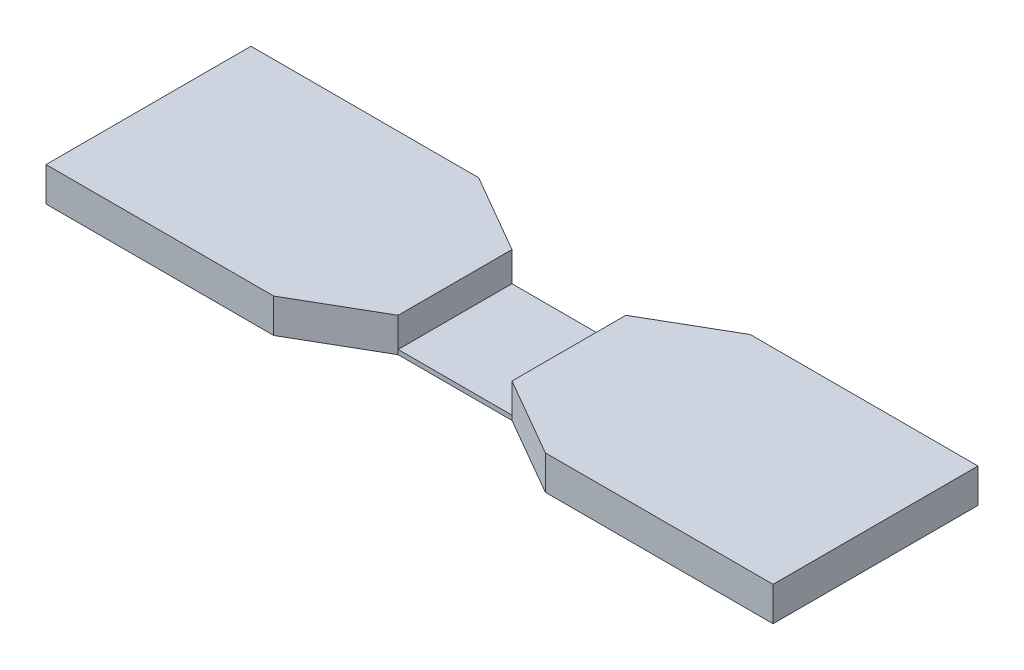
ISO-10303-21;
HEADER;
FILE_DESCRIPTION(('STEP AP214'),'2;1');
FILE_NAME('part.step','',(''),(''),'','','');
FILE_SCHEMA(('AUTOMOTIVE_DESIGN { 1 0 10303 214 1 1 1 1 }'));
ENDSEC;
DATA;
#1=APPLICATION_CONTEXT('core data for automotive mechanical design processes');
#2=APPLICATION_PROTOCOL_DEFINITION('international standard','automotive_design',2000,#1);
#3=PRODUCT_CONTEXT('',#1,'mechanical');
#4=PRODUCT('Part','Part','',(#3));
#5=PRODUCT_RELATED_PRODUCT_CATEGORY('part','',(#4));
#6=PRODUCT_DEFINITION_FORMATION('','',#4);
#7=PRODUCT_DEFINITION_CONTEXT('part definition',#1,'design');
#8=PRODUCT_DEFINITION('design','',#6,#7);
#9=PRODUCT_DEFINITION_SHAPE('','',#8);
#10=(LENGTH_UNIT() NAMED_UNIT(*) SI_UNIT(.MILLI.,.METRE.));
#11=(NAMED_UNIT(*) PLANE_ANGLE_UNIT() SI_UNIT($,.RADIAN.));
#12=(NAMED_UNIT(*) SI_UNIT($,.STERADIAN.) SOLID_ANGLE_UNIT());
#13=UNCERTAINTY_MEASURE_WITH_UNIT(LENGTH_MEASURE(1.E-05),#10,'distance_accuracy_value','');
#14=(GEOMETRIC_REPRESENTATION_CONTEXT(3) GLOBAL_UNCERTAINTY_ASSIGNED_CONTEXT((#13)) GLOBAL_UNIT_ASSIGNED_CONTEXT((#10,
#11,#12)) REPRESENTATION_CONTEXT('',''));
#15=CARTESIAN_POINT('',(0.,0.,0.));
#16=DIRECTION('',(0.,0.,1.));
#17=DIRECTION('',(1.,0.,0.));
#18=AXIS2_PLACEMENT_3D('',#15,#16,#17);
#19=CARTESIAN_POINT('',(-9.99999999999999,3.,0.));
#20=DIRECTION('',(1.,0.,0.));
#21=DIRECTION('',(0.,0.,-1.));
#22=AXIS2_PLACEMENT_3D('',#19,#20,#21);
#23=PLANE('',#22);
#24=DIRECTION('',(0.,0.,1.));
#25=VECTOR('',#24,1.);
#26=CARTESIAN_POINT('',(-9.99999999999999,0.4,0.));
#27=LINE('',#26,#25);
#28=CARTESIAN_POINT('',(-10.,0.4,-5.02967359050444));
#29=VERTEX_POINT('',#28);
#30=CARTESIAN_POINT('',(-9.99999999999999,0.4,4.97032640949555));
#31=VERTEX_POINT('',#30);
#32=EDGE_CURVE('E55',#29,#31,#27,.T.);
#33=ORIENTED_EDGE('',*,*,#32,.F.);
#34=DIRECTION('',(0.,-1.,0.));
#35=VECTOR('',#34,1.);
#36=CARTESIAN_POINT('',(-10.,3.,-5.02967359050444));
#37=LINE('',#36,#35);
#38=CARTESIAN_POINT('',(-10.,3.,-5.02967359050444));
#39=VERTEX_POINT('',#38);
#40=EDGE_CURVE('E11',#39,#29,#37,.T.);
#41=ORIENTED_EDGE('',*,*,#40,.F.);
#42=DIRECTION('',(0.,0.,1.));
#43=VECTOR('',#42,1.);
#44=CARTESIAN_POINT('',(-9.99999999999999,3.,0.));
#45=LINE('',#44,#43);
#46=CARTESIAN_POINT('',(-9.99999999999999,3.,4.97032640949555));
#47=VERTEX_POINT('',#46);
#48=EDGE_CURVE('E144',#39,#47,#45,.T.);
#49=ORIENTED_EDGE('',*,*,#48,.T.);
#50=DIRECTION('',(0.,-1.,0.));
#51=VECTOR('',#50,1.);
#52=CARTESIAN_POINT('',(-9.99999999999999,3.,4.97032640949555));
#53=LINE('',#52,#51);
#54=EDGE_CURVE('E62',#47,#31,#53,.T.);
#55=ORIENTED_EDGE('',*,*,#54,.T.);
#56=EDGE_LOOP('',(#33,#41,#49,#55));
#57=FACE_BOUND('',#56,.T.);
#58=ADVANCED_FACE('F41',(#57),#23,.T.);
#59=CARTESIAN_POINT('',(-0.322087448939741,3.,0.557871826043876));
#60=DIRECTION('',(-0.500000000000001,0.,0.866025403784438));
#61=DIRECTION('',(0.866025403784438,0.,0.500000000000001));
#62=AXIS2_PLACEMENT_3D('',#59,#60,#61);
#63=PLANE('',#62);
#64=DIRECTION('',(-0.866025403784438,0.,-0.500000000000001));
#65=VECTOR('',#64,1.);
#66=CARTESIAN_POINT('',(-0.322087448939741,0.,0.557871826043876));
#67=LINE('',#66,#65);
#68=CARTESIAN_POINT('',(-10.,0.,-5.02967359050444));
#69=VERTEX_POINT('',#68);
#70=CARTESIAN_POINT('',(-16.9282032302755,0.,-9.02967359050445));
#71=VERTEX_POINT('',#70);
#72=EDGE_CURVE('E135',#69,#71,#67,.T.);
#73=ORIENTED_EDGE('',*,*,#72,.T.);
#74=DIRECTION('',(0.,-1.,0.));
#75=VECTOR('',#74,1.);
#76=CARTESIAN_POINT('',(-16.9282032302755,3.,-9.02967359050445));
#77=LINE('',#76,#75);
#78=CARTESIAN_POINT('',(-16.9282032302755,3.,-9.02967359050445));
#79=VERTEX_POINT('',#78);
#80=EDGE_CURVE('E48',#79,#71,#77,.T.);
#81=ORIENTED_EDGE('',*,*,#80,.F.);
#82=DIRECTION('',(-0.866025403784438,0.,-0.500000000000001));
#83=VECTOR('',#82,1.);
#84=CARTESIAN_POINT('',(-0.322087448939741,3.,0.557871826043876));
#85=LINE('',#84,#83);
#86=EDGE_CURVE('E188',#39,#79,#85,.T.);
#87=ORIENTED_EDGE('',*,*,#86,.F.);
#88=ORIENTED_EDGE('',*,*,#40,.T.);
#89=DIRECTION('',(0.,-1.,0.));
#90=VECTOR('',#89,1.);
#91=CARTESIAN_POINT('',(-10.,0.4,-5.02967359050444));
#92=LINE('',#91,#90);
#93=EDGE_CURVE('E183',#29,#69,#92,.T.);
#94=ORIENTED_EDGE('',*,*,#93,.T.);
#95=EDGE_LOOP('',(#73,#81,#87,#88,#94));
#96=FACE_BOUND('',#95,.T.);
#97=ADVANCED_FACE('F189',(#96),#63,.F.);
#98=CARTESIAN_POINT('',(0.,3.,-9.02967359050445));
#99=DIRECTION('',(0.,0.,1.));
#100=DIRECTION('',(1.,0.,0.));
#101=AXIS2_PLACEMENT_3D('',#98,#99,#100);
#102=PLANE('',#101);
#103=DIRECTION('',(-1.,0.,0.));
#104=VECTOR('',#103,1.);
#105=CARTESIAN_POINT('',(0.,0.,-9.02967359050445));
#106=LINE('',#105,#104);
#107=CARTESIAN_POINT('',(-36.9282032302755,0.,-9.02967359050444));
#108=VERTEX_POINT('',#107);
#109=EDGE_CURVE('E137',#71,#108,#106,.T.);
#110=ORIENTED_EDGE('',*,*,#109,.T.);
#111=DIRECTION('',(0.,-1.,0.));
#112=VECTOR('',#111,1.);
#113=CARTESIAN_POINT('',(-36.9282032302755,3.,-9.02967359050444));
#114=LINE('',#113,#112);
#115=CARTESIAN_POINT('',(-36.9282032302755,3.,-9.02967359050444));
#116=VERTEX_POINT('',#115);
#117=EDGE_CURVE('E126',#116,#108,#114,.T.);
#118=ORIENTED_EDGE('',*,*,#117,.F.);
#119=DIRECTION('',(-1.,0.,0.));
#120=VECTOR('',#119,1.);
#121=CARTESIAN_POINT('',(0.,3.,-9.02967359050445));
#122=LINE('',#121,#120);
#123=EDGE_CURVE('E113',#79,#116,#122,.T.);
#124=ORIENTED_EDGE('',*,*,#123,.F.);
#125=ORIENTED_EDGE('',*,*,#80,.T.);
#126=EDGE_LOOP('',(#110,#118,#124,#125));
#127=FACE_BOUND('',#126,.T.);
#128=ADVANCED_FACE('F151',(#127),#102,.F.);
#129=CARTESIAN_POINT('',(-36.9282032302755,3.,0.));
#130=DIRECTION('',(1.,0.,0.));
#131=DIRECTION('',(0.,0.,-1.));
#132=AXIS2_PLACEMENT_3D('',#129,#130,#131);
#133=PLANE('',#132);
#134=DIRECTION('',(0.,0.,1.));
#135=VECTOR('',#134,1.);
#136=CARTESIAN_POINT('',(-36.9282032302755,0.,0.));
#137=LINE('',#136,#135);
#138=CARTESIAN_POINT('',(-36.9282032302755,0.,8.97032640949555));
#139=VERTEX_POINT('',#138);
#140=EDGE_CURVE('E122',#108,#139,#137,.T.);
#141=ORIENTED_EDGE('',*,*,#140,.T.);
#142=DIRECTION('',(0.,-1.,0.));
#143=VECTOR('',#142,1.);
#144=CARTESIAN_POINT('',(-36.9282032302755,3.,8.97032640949555));
#145=LINE('',#144,#143);
#146=CARTESIAN_POINT('',(-36.9282032302755,3.,8.97032640949555));
#147=VERTEX_POINT('',#146);
#148=EDGE_CURVE('E119',#147,#139,#145,.T.);
#149=ORIENTED_EDGE('',*,*,#148,.F.);
#150=DIRECTION('',(0.,0.,1.));
#151=VECTOR('',#150,1.);
#152=CARTESIAN_POINT('',(-36.9282032302755,3.,0.));
#153=LINE('',#152,#151);
#154=EDGE_CURVE('E105',#116,#147,#153,.T.);
#155=ORIENTED_EDGE('',*,*,#154,.F.);
#156=ORIENTED_EDGE('',*,*,#117,.T.);
#157=EDGE_LOOP('',(#141,#149,#155,#156));
#158=FACE_BOUND('',#157,.T.);
#159=ADVANCED_FACE('F120',(#158),#133,.F.);
#160=CARTESIAN_POINT('',(0.,3.,8.97032640949556));
#161=DIRECTION('',(0.,0.,1.));
#162=DIRECTION('',(1.,0.,0.));
#163=AXIS2_PLACEMENT_3D('',#160,#161,#162);
#164=PLANE('',#163);
#165=DIRECTION('',(-1.,0.,0.));
#166=VECTOR('',#165,1.);
#167=CARTESIAN_POINT('',(0.,0.,8.97032640949556));
#168=LINE('',#167,#166);
#169=CARTESIAN_POINT('',(-16.9282032302755,0.,8.97032640949556));
#170=VERTEX_POINT('',#169);
#171=EDGE_CURVE('E141',#170,#139,#168,.T.);
#172=ORIENTED_EDGE('',*,*,#171,.F.);
#173=DIRECTION('',(0.,-1.,0.));
#174=VECTOR('',#173,1.);
#175=CARTESIAN_POINT('',(-16.9282032302755,3.,8.97032640949556));
#176=LINE('',#175,#174);
#177=CARTESIAN_POINT('',(-16.9282032302755,3.,8.97032640949556));
#178=VERTEX_POINT('',#177);
#179=EDGE_CURVE('E127',#178,#170,#176,.T.);
#180=ORIENTED_EDGE('',*,*,#179,.F.);
#181=DIRECTION('',(-1.,0.,0.));
#182=VECTOR('',#181,1.);
#183=CARTESIAN_POINT('',(0.,3.,8.97032640949556));
#184=LINE('',#183,#182);
#185=EDGE_CURVE('E111',#178,#147,#184,.T.);
#186=ORIENTED_EDGE('',*,*,#185,.T.);
#187=ORIENTED_EDGE('',*,*,#148,.T.);
#188=EDGE_LOOP('',(#172,#180,#186,#187));
#189=FACE_BOUND('',#188,.T.);
#190=ADVANCED_FACE('F129',(#189),#164,.T.);
#191=CARTESIAN_POINT('',(-0.347785532138085,3.,-0.602382211800541));
#192=DIRECTION('',(0.500000000000001,0.,0.866025403784438));
#193=DIRECTION('',(0.866025403784438,0.,-0.500000000000001));
#194=AXIS2_PLACEMENT_3D('',#191,#192,#193);
#195=PLANE('',#194);
#196=DIRECTION('',(-0.866025403784438,0.,0.500000000000001));
#197=VECTOR('',#196,1.);
#198=CARTESIAN_POINT('',(-0.347785532138085,0.,-0.602382211800541));
#199=LINE('',#198,#197);
#200=CARTESIAN_POINT('',(-9.99999999999999,0.,4.97032640949555));
#201=VERTEX_POINT('',#200);
#202=EDGE_CURVE('E88',#201,#170,#199,.T.);
#203=ORIENTED_EDGE('',*,*,#202,.F.);
#204=DIRECTION('',(0.,-1.,0.));
#205=VECTOR('',#204,1.);
#206=CARTESIAN_POINT('',(-9.99999999999999,0.4,4.97032640949555));
#207=LINE('',#206,#205);
#208=EDGE_CURVE('E180',#31,#201,#207,.T.);
#209=ORIENTED_EDGE('',*,*,#208,.F.);
#210=ORIENTED_EDGE('',*,*,#54,.F.);
#211=DIRECTION('',(-0.866025403784438,0.,0.500000000000001));
#212=VECTOR('',#211,1.);
#213=CARTESIAN_POINT('',(-0.347785532138085,3.,-0.602382211800541));
#214=LINE('',#213,#212);
#215=EDGE_CURVE('E130',#47,#178,#214,.T.);
#216=ORIENTED_EDGE('',*,*,#215,.T.);
#217=ORIENTED_EDGE('',*,*,#179,.T.);
#218=EDGE_LOOP('',(#203,#209,#210,#216,#217));
#219=FACE_BOUND('',#218,.T.);
#220=ADVANCED_FACE('F329',(#219),#195,.T.);
#221=CARTESIAN_POINT('',(0.,3.,0.));
#222=DIRECTION('',(0.,1.,0.));
#223=DIRECTION('',(0.,0.,1.));
#224=AXIS2_PLACEMENT_3D('',#221,#222,#223);
#225=PLANE('',#224);
#226=ORIENTED_EDGE('',*,*,#48,.F.);
#227=ORIENTED_EDGE('',*,*,#86,.T.);
#228=ORIENTED_EDGE('',*,*,#123,.T.);
#229=ORIENTED_EDGE('',*,*,#154,.T.);
#230=ORIENTED_EDGE('',*,*,#185,.F.);
#231=ORIENTED_EDGE('',*,*,#215,.F.);
#232=EDGE_LOOP('',(#226,#227,#228,#229,#230,#231));
#233=FACE_BOUND('',#232,.T.);
#234=ADVANCED_FACE('F108',(#233),#225,.T.);
#235=CARTESIAN_POINT('',(0.,0.,0.));
#236=DIRECTION('',(0.,1.,0.));
#237=DIRECTION('',(0.,0.,1.));
#238=AXIS2_PLACEMENT_3D('',#235,#236,#237);
#239=PLANE('',#238);
#240=ORIENTED_EDGE('',*,*,#72,.F.);
#241=DIRECTION('',(-1.,0.,0.));
#242=VECTOR('',#241,1.);
#243=CARTESIAN_POINT('',(0.,0.,-5.02967359050444));
#244=LINE('',#243,#242);
#245=CARTESIAN_POINT('',(0.,0.,-5.02967359050444));
#246=VERTEX_POINT('',#245);
#247=EDGE_CURVE('E169',#246,#69,#244,.T.);
#248=ORIENTED_EDGE('',*,*,#247,.F.);
#249=DIRECTION('',(0.866025403784438,0.,-0.500000000000002));
#250=VECTOR('',#249,1.);
#251=CARTESIAN_POINT('',(-2.17791255106027,0.,-3.77225519287832));
#252=LINE('',#251,#250);
#253=CARTESIAN_POINT('',(6.92820323027551,0.,-9.02967359050445));
#254=VERTEX_POINT('',#253);
#255=EDGE_CURVE('E208',#246,#254,#252,.T.);
#256=ORIENTED_EDGE('',*,*,#255,.T.);
#257=DIRECTION('',(1.,0.,0.));
#258=VECTOR('',#257,1.);
#259=CARTESIAN_POINT('',(0.,0.,-9.02967359050445));
#260=LINE('',#259,#258);
#261=CARTESIAN_POINT('',(26.9282032302755,0.,-9.02967359050445));
#262=VERTEX_POINT('',#261);
#263=EDGE_CURVE('E231',#254,#262,#260,.T.);
#264=ORIENTED_EDGE('',*,*,#263,.T.);
#265=DIRECTION('',(0.,0.,1.));
#266=VECTOR('',#265,1.);
#267=CARTESIAN_POINT('',(26.9282032302755,0.,0.));
#268=LINE('',#267,#266);
#269=CARTESIAN_POINT('',(26.9282032302755,0.,8.97032640949554));
#270=VERTEX_POINT('',#269);
#271=EDGE_CURVE('E228',#262,#270,#268,.T.);
#272=ORIENTED_EDGE('',*,*,#271,.T.);
#273=DIRECTION('',(1.,0.,0.));
#274=VECTOR('',#273,1.);
#275=CARTESIAN_POINT('',(0.,0.,8.97032640949556));
#276=LINE('',#275,#274);
#277=CARTESIAN_POINT('',(6.92820323027551,0.,8.97032640949555));
#278=VERTEX_POINT('',#277);
#279=EDGE_CURVE('E220',#278,#270,#276,.T.);
#280=ORIENTED_EDGE('',*,*,#279,.F.);
#281=DIRECTION('',(0.866025403784438,0.,0.500000000000001));
#282=VECTOR('',#281,1.);
#283=CARTESIAN_POINT('',(-2.15221446786192,0.,3.72774480712165));
#284=LINE('',#283,#282);
#285=CARTESIAN_POINT('',(0.,0.,4.97032640949555));
#286=VERTEX_POINT('',#285);
#287=EDGE_CURVE('E164',#286,#278,#284,.T.);
#288=ORIENTED_EDGE('',*,*,#287,.F.);
#289=DIRECTION('',(-1.,0.,0.));
#290=VECTOR('',#289,1.);
#291=CARTESIAN_POINT('',(0.,0.,4.97032640949555));
#292=LINE('',#291,#290);
#293=EDGE_CURVE('E161',#286,#201,#292,.T.);
#294=ORIENTED_EDGE('',*,*,#293,.T.);
#295=ORIENTED_EDGE('',*,*,#202,.T.);
#296=ORIENTED_EDGE('',*,*,#171,.T.);
#297=ORIENTED_EDGE('',*,*,#140,.F.);
#298=ORIENTED_EDGE('',*,*,#109,.F.);
#299=EDGE_LOOP('',(#240,#248,#256,#264,#272,#280,#288,#294,#295,#296,#297,#298));
#300=FACE_BOUND('',#299,.T.);
#301=ADVANCED_FACE('F155',(#300),#239,.F.);
#302=CARTESIAN_POINT('',(0.,0.4,-5.02967359050444));
#303=DIRECTION('',(0.,0.,1.));
#304=DIRECTION('',(1.,0.,0.));
#305=AXIS2_PLACEMENT_3D('',#302,#303,#304);
#306=PLANE('',#305);
#307=ORIENTED_EDGE('',*,*,#247,.T.);
#308=ORIENTED_EDGE('',*,*,#93,.F.);
#309=DIRECTION('',(-1.,0.,0.));
#310=VECTOR('',#309,1.);
#311=CARTESIAN_POINT('',(0.,0.4,-5.02967359050444));
#312=LINE('',#311,#310);
#313=CARTESIAN_POINT('',(0.,0.4,-5.02967359050444));
#314=VERTEX_POINT('',#313);
#315=EDGE_CURVE('E172',#314,#29,#312,.T.);
#316=ORIENTED_EDGE('',*,*,#315,.F.);
#317=DIRECTION('',(0.,-1.,0.));
#318=VECTOR('',#317,1.);
#319=CARTESIAN_POINT('',(0.,0.4,-5.02967359050444));
#320=LINE('',#319,#318);
#321=EDGE_CURVE('E138',#314,#246,#320,.T.);
#322=ORIENTED_EDGE('',*,*,#321,.T.);
#323=EDGE_LOOP('',(#307,#308,#316,#322));
#324=FACE_BOUND('',#323,.T.);
#325=ADVANCED_FACE('F202',(#324),#306,.F.);
#326=CARTESIAN_POINT('',(0.,0.4,4.97032640949555));
#327=DIRECTION('',(0.,0.,1.));
#328=DIRECTION('',(1.,0.,0.));
#329=AXIS2_PLACEMENT_3D('',#326,#327,#328);
#330=PLANE('',#329);
#331=ORIENTED_EDGE('',*,*,#293,.F.);
#332=DIRECTION('',(0.,-1.,0.));
#333=VECTOR('',#332,1.);
#334=CARTESIAN_POINT('',(0.,0.4,4.97032640949555));
#335=LINE('',#334,#333);
#336=CARTESIAN_POINT('',(0.,0.4,4.97032640949555));
#337=VERTEX_POINT('',#336);
#338=EDGE_CURVE('E178',#337,#286,#335,.T.);
#339=ORIENTED_EDGE('',*,*,#338,.F.);
#340=DIRECTION('',(-1.,0.,0.));
#341=VECTOR('',#340,1.);
#342=CARTESIAN_POINT('',(0.,0.4,4.97032640949555));
#343=LINE('',#342,#341);
#344=EDGE_CURVE('E181',#337,#31,#343,.T.);
#345=ORIENTED_EDGE('',*,*,#344,.T.);
#346=ORIENTED_EDGE('',*,*,#208,.T.);
#347=EDGE_LOOP('',(#331,#339,#345,#346));
#348=FACE_BOUND('',#347,.T.);
#349=ADVANCED_FACE('F248',(#348),#330,.T.);
#350=CARTESIAN_POINT('',(0.,0.4,0.));
#351=DIRECTION('',(0.,1.,0.));
#352=DIRECTION('',(0.,0.,1.));
#353=AXIS2_PLACEMENT_3D('',#350,#351,#352);
#354=PLANE('',#353);
#355=DIRECTION('',(0.,0.,1.));
#356=VECTOR('',#355,1.);
#357=CARTESIAN_POINT('',(0.,0.4,0.));
#358=LINE('',#357,#356);
#359=EDGE_CURVE('E168',#314,#337,#358,.T.);
#360=ORIENTED_EDGE('',*,*,#359,.F.);
#361=ORIENTED_EDGE('',*,*,#315,.T.);
#362=ORIENTED_EDGE('',*,*,#32,.T.);
#363=ORIENTED_EDGE('',*,*,#344,.F.);
#364=EDGE_LOOP('',(#360,#361,#362,#363));
#365=FACE_BOUND('',#364,.T.);
#366=ADVANCED_FACE('F195',(#365),#354,.T.);
#367=CARTESIAN_POINT('',(0.,3.,0.));
#368=DIRECTION('',(1.,0.,0.));
#369=DIRECTION('',(0.,0.,-1.));
#370=AXIS2_PLACEMENT_3D('',#367,#368,#369);
#371=PLANE('',#370);
#372=DIRECTION('',(0.,-1.,0.));
#373=VECTOR('',#372,1.);
#374=CARTESIAN_POINT('',(0.,3.,-5.02967359050444));
#375=LINE('',#374,#373);
#376=CARTESIAN_POINT('',(0.,3.,-5.02967359050444));
#377=VERTEX_POINT('',#376);
#378=EDGE_CURVE('E174',#377,#314,#375,.T.);
#379=ORIENTED_EDGE('',*,*,#378,.T.);
#380=ORIENTED_EDGE('',*,*,#359,.T.);
#381=DIRECTION('',(0.,-1.,0.));
#382=VECTOR('',#381,1.);
#383=CARTESIAN_POINT('',(0.,3.,4.97032640949555));
#384=LINE('',#383,#382);
#385=CARTESIAN_POINT('',(0.,3.,4.97032640949555));
#386=VERTEX_POINT('',#385);
#387=EDGE_CURVE('E244',#386,#337,#384,.T.);
#388=ORIENTED_EDGE('',*,*,#387,.F.);
#389=DIRECTION('',(0.,0.,1.));
#390=VECTOR('',#389,1.);
#391=CARTESIAN_POINT('',(0.,3.,0.));
#392=LINE('',#391,#390);
#393=EDGE_CURVE('E280',#377,#386,#392,.T.);
#394=ORIENTED_EDGE('',*,*,#393,.F.);
#395=EDGE_LOOP('',(#379,#380,#388,#394));
#396=FACE_BOUND('',#395,.T.);
#397=ADVANCED_FACE('F281',(#396),#371,.F.);
#398=CARTESIAN_POINT('',(-2.17791255106027,3.,-3.77225519287832));
#399=DIRECTION('',(-0.500000000000001,0.,-0.866025403784438));
#400=DIRECTION('',(-0.866025403784438,0.,0.500000000000002));
#401=AXIS2_PLACEMENT_3D('',#398,#399,#400);
#402=PLANE('',#401);
#403=ORIENTED_EDGE('',*,*,#255,.F.);
#404=ORIENTED_EDGE('',*,*,#321,.F.);
#405=ORIENTED_EDGE('',*,*,#378,.F.);
#406=DIRECTION('',(0.866025403784438,0.,-0.500000000000002));
#407=VECTOR('',#406,1.);
#408=CARTESIAN_POINT('',(-2.17791255106027,3.,-3.77225519287832));
#409=LINE('',#408,#407);
#410=CARTESIAN_POINT('',(6.92820323027551,3.,-9.02967359050445));
#411=VERTEX_POINT('',#410);
#412=EDGE_CURVE('E233',#377,#411,#409,.T.);
#413=ORIENTED_EDGE('',*,*,#412,.T.);
#414=DIRECTION('',(0.,-1.,0.));
#415=VECTOR('',#414,1.);
#416=CARTESIAN_POINT('',(6.92820323027551,3.,-9.02967359050445));
#417=LINE('',#416,#415);
#418=EDGE_CURVE('E218',#411,#254,#417,.T.);
#419=ORIENTED_EDGE('',*,*,#418,.T.);
#420=EDGE_LOOP('',(#403,#404,#405,#413,#419));
#421=FACE_BOUND('',#420,.T.);
#422=ADVANCED_FACE('F213',(#421),#402,.T.);
#423=CARTESIAN_POINT('',(-2.15221446786192,3.,3.72774480712165));
#424=DIRECTION('',(0.500000000000001,0.,-0.866025403784438));
#425=DIRECTION('',(-0.866025403784438,0.,-0.500000000000001));
#426=AXIS2_PLACEMENT_3D('',#423,#424,#425);
#427=PLANE('',#426);
#428=ORIENTED_EDGE('',*,*,#287,.T.);
#429=DIRECTION('',(0.,-1.,0.));
#430=VECTOR('',#429,1.);
#431=CARTESIAN_POINT('',(6.92820323027551,3.,8.97032640949555));
#432=LINE('',#431,#430);
#433=CARTESIAN_POINT('',(6.92820323027551,3.,8.97032640949555));
#434=VERTEX_POINT('',#433);
#435=EDGE_CURVE('E241',#434,#278,#432,.T.);
#436=ORIENTED_EDGE('',*,*,#435,.F.);
#437=DIRECTION('',(0.866025403784438,0.,0.500000000000001));
#438=VECTOR('',#437,1.);
#439=CARTESIAN_POINT('',(-2.15221446786192,3.,3.72774480712165));
#440=LINE('',#439,#438);
#441=EDGE_CURVE('E284',#386,#434,#440,.T.);
#442=ORIENTED_EDGE('',*,*,#441,.F.);
#443=ORIENTED_EDGE('',*,*,#387,.T.);
#444=ORIENTED_EDGE('',*,*,#338,.T.);
#445=EDGE_LOOP('',(#428,#436,#442,#443,#444));
#446=FACE_BOUND('',#445,.T.);
#447=ADVANCED_FACE('F306',(#446),#427,.F.);
#448=CARTESIAN_POINT('',(0.,3.,8.97032640949556));
#449=DIRECTION('',(0.,0.,-1.));
#450=DIRECTION('',(-1.,0.,0.));
#451=AXIS2_PLACEMENT_3D('',#448,#449,#450);
#452=PLANE('',#451);
#453=ORIENTED_EDGE('',*,*,#279,.T.);
#454=DIRECTION('',(0.,-1.,0.));
#455=VECTOR('',#454,1.);
#456=CARTESIAN_POINT('',(26.9282032302755,3.,8.97032640949554));
#457=LINE('',#456,#455);
#458=CARTESIAN_POINT('',(26.9282032302755,3.,8.97032640949554));
#459=VERTEX_POINT('',#458);
#460=EDGE_CURVE('E238',#459,#270,#457,.T.);
#461=ORIENTED_EDGE('',*,*,#460,.F.);
#462=DIRECTION('',(1.,0.,0.));
#463=VECTOR('',#462,1.);
#464=CARTESIAN_POINT('',(0.,3.,8.97032640949556));
#465=LINE('',#464,#463);
#466=EDGE_CURVE('E292',#434,#459,#465,.T.);
#467=ORIENTED_EDGE('',*,*,#466,.F.);
#468=ORIENTED_EDGE('',*,*,#435,.T.);
#469=EDGE_LOOP('',(#453,#461,#467,#468));
#470=FACE_BOUND('',#469,.T.);
#471=ADVANCED_FACE('F303',(#470),#452,.F.);
#472=CARTESIAN_POINT('',(26.9282032302755,3.,0.));
#473=DIRECTION('',(1.,0.,0.));
#474=DIRECTION('',(0.,0.,-1.));
#475=AXIS2_PLACEMENT_3D('',#472,#473,#474);
#476=PLANE('',#475);
#477=ORIENTED_EDGE('',*,*,#271,.F.);
#478=DIRECTION('',(0.,-1.,0.));
#479=VECTOR('',#478,1.);
#480=CARTESIAN_POINT('',(26.9282032302755,3.,-9.02967359050445));
#481=LINE('',#480,#479);
#482=CARTESIAN_POINT('',(26.9282032302755,3.,-9.02967359050445));
#483=VERTEX_POINT('',#482);
#484=EDGE_CURVE('E235',#483,#262,#481,.T.);
#485=ORIENTED_EDGE('',*,*,#484,.F.);
#486=DIRECTION('',(0.,0.,1.));
#487=VECTOR('',#486,1.);
#488=CARTESIAN_POINT('',(26.9282032302755,3.,0.));
#489=LINE('',#488,#487);
#490=EDGE_CURVE('E293',#483,#459,#489,.T.);
#491=ORIENTED_EDGE('',*,*,#490,.T.);
#492=ORIENTED_EDGE('',*,*,#460,.T.);
#493=EDGE_LOOP('',(#477,#485,#491,#492));
#494=FACE_BOUND('',#493,.T.);
#495=ADVANCED_FACE('F299',(#494),#476,.T.);
#496=CARTESIAN_POINT('',(0.,3.,-9.02967359050445));
#497=DIRECTION('',(0.,0.,-1.));
#498=DIRECTION('',(-1.,0.,0.));
#499=AXIS2_PLACEMENT_3D('',#496,#497,#498);
#500=PLANE('',#499);
#501=ORIENTED_EDGE('',*,*,#263,.F.);
#502=ORIENTED_EDGE('',*,*,#418,.F.);
#503=DIRECTION('',(1.,0.,0.));
#504=VECTOR('',#503,1.);
#505=CARTESIAN_POINT('',(0.,3.,-9.02967359050445));
#506=LINE('',#505,#504);
#507=EDGE_CURVE('E223',#411,#483,#506,.T.);
#508=ORIENTED_EDGE('',*,*,#507,.T.);
#509=ORIENTED_EDGE('',*,*,#484,.T.);
#510=EDGE_LOOP('',(#501,#502,#508,#509));
#511=FACE_BOUND('',#510,.T.);
#512=ADVANCED_FACE('F297',(#511),#500,.T.);
#513=CARTESIAN_POINT('',(0.,3.,0.));
#514=DIRECTION('',(0.,1.,0.));
#515=DIRECTION('',(0.,0.,1.));
#516=AXIS2_PLACEMENT_3D('',#513,#514,#515);
#517=PLANE('',#516);
#518=ORIENTED_EDGE('',*,*,#412,.F.);
#519=ORIENTED_EDGE('',*,*,#393,.T.);
#520=ORIENTED_EDGE('',*,*,#441,.T.);
#521=ORIENTED_EDGE('',*,*,#466,.T.);
#522=ORIENTED_EDGE('',*,*,#490,.F.);
#523=ORIENTED_EDGE('',*,*,#507,.F.);
#524=EDGE_LOOP('',(#518,#519,#520,#521,#522,#523));
#525=FACE_BOUND('',#524,.T.);
#526=ADVANCED_FACE('F286',(#525),#517,.T.);
#527=CLOSED_SHELL('',(#58,#97,#128,#159,#190,#220,#234,#301,#325,#349,#366,#397,#422,#447,#471,
#495,#512,#526));
#528=MANIFOLD_SOLID_BREP('B2',#527);
#529=ADVANCED_BREP_SHAPE_REPRESENTATION('',(#18,#528),#14);
#530=SHAPE_DEFINITION_REPRESENTATION(#9,#529);
ENDSEC;
END-ISO-10303-21;
